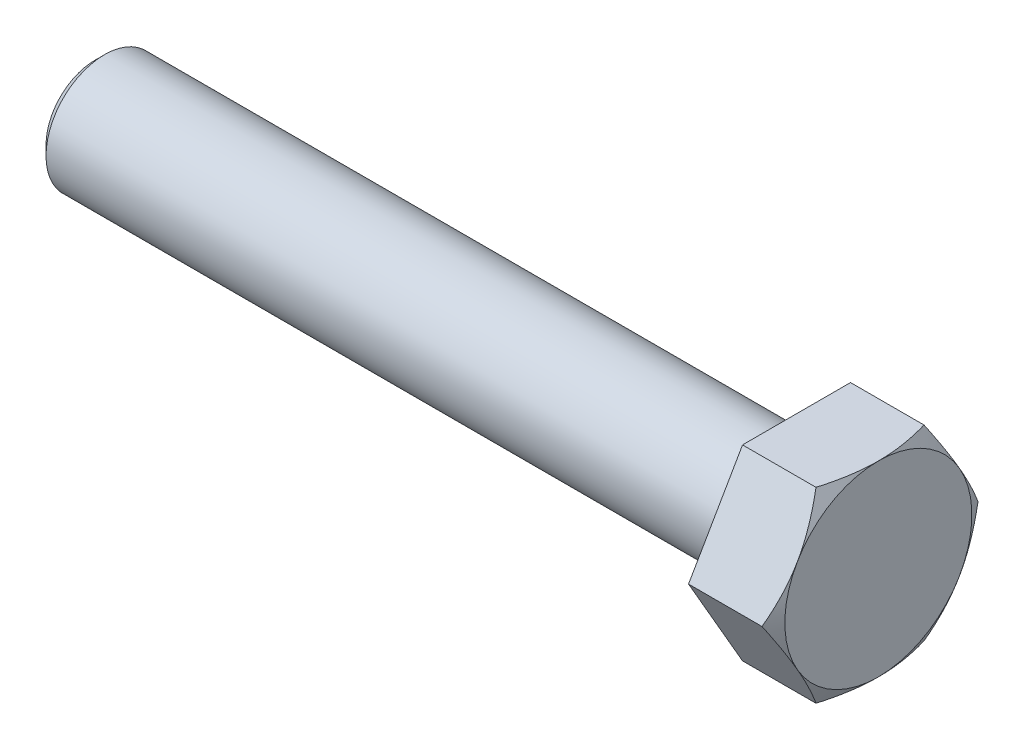
ISO-10303-21;
HEADER;
FILE_DESCRIPTION(('STEP AP214'),'2;1');
FILE_NAME('part.step','',(''),(''),'','','');
FILE_SCHEMA(('AUTOMOTIVE_DESIGN { 1 0 10303 214 1 1 1 1 }'));
ENDSEC;
DATA;
#1=APPLICATION_CONTEXT('core data for automotive mechanical design processes');
#2=APPLICATION_PROTOCOL_DEFINITION('international standard','automotive_design',2000,#1);
#3=PRODUCT_CONTEXT('',#1,'mechanical');
#4=PRODUCT('Part','Part','',(#3));
#5=PRODUCT_RELATED_PRODUCT_CATEGORY('part','',(#4));
#6=PRODUCT_DEFINITION_FORMATION('','',#4);
#7=PRODUCT_DEFINITION_CONTEXT('part definition',#1,'design');
#8=PRODUCT_DEFINITION('design','',#6,#7);
#9=PRODUCT_DEFINITION_SHAPE('','',#8);
#10=(LENGTH_UNIT() NAMED_UNIT(*) SI_UNIT(.MILLI.,.METRE.));
#11=(NAMED_UNIT(*) PLANE_ANGLE_UNIT() SI_UNIT($,.RADIAN.));
#12=(NAMED_UNIT(*) SI_UNIT($,.STERADIAN.) SOLID_ANGLE_UNIT());
#13=UNCERTAINTY_MEASURE_WITH_UNIT(LENGTH_MEASURE(1.E-05),#10,'distance_accuracy_value','');
#14=(GEOMETRIC_REPRESENTATION_CONTEXT(3) GLOBAL_UNCERTAINTY_ASSIGNED_CONTEXT((#13)) GLOBAL_UNIT_ASSIGNED_CONTEXT((#10,
#11,#12)) REPRESENTATION_CONTEXT('',''));
#15=CARTESIAN_POINT('',(0.,0.,0.));
#16=DIRECTION('',(0.,0.,1.));
#17=DIRECTION('',(1.,0.,0.));
#18=AXIS2_PLACEMENT_3D('',#15,#16,#17);
#19=CARTESIAN_POINT('',(0.,0.,0.));
#20=DIRECTION('',(1.,0.,0.));
#21=DIRECTION('',(0.,0.,-1.));
#22=AXIS2_PLACEMENT_3D('',#19,#20,#21);
#23=CYLINDRICAL_SURFACE('',#22,2.1);
#24=CARTESIAN_POINT('',(0.,0.,0.));
#25=DIRECTION('',(1.,0.,0.));
#26=DIRECTION('',(0.,0.,1.));
#27=AXIS2_PLACEMENT_3D('',#24,#25,#26);
#28=CIRCLE('',#27,2.1);
#29=CARTESIAN_POINT('',(0.,0.,2.1));
#30=VERTEX_POINT('',#29);
#31=EDGE_CURVE('P0_E11',#30,#30,#28,.T.);
#32=ORIENTED_EDGE('',*,*,#31,.T.);
#33=CARTESIAN_POINT('',(30.,0.,2.1));
#34=DIRECTION('',(-1.,0.,0.));
#35=VECTOR('',#34,1.);
#36=LINE('',#33,#35);
#37=CARTESIAN_POINT('',(30.,0.,2.1));
#38=VERTEX_POINT('',#37);
#39=EDGE_CURVE('P0_E24',#38,#30,#36,.T.);
#40=ORIENTED_EDGE('',*,*,#39,.F.);
#41=CARTESIAN_POINT('',(30.,0.,0.));
#42=DIRECTION('',(-1.,0.,0.));
#43=DIRECTION('',(0.,0.,1.));
#44=AXIS2_PLACEMENT_3D('',#41,#42,#43);
#45=CIRCLE('',#44,2.1);
#46=EDGE_CURVE('P0_E33',#38,#38,#45,.T.);
#47=ORIENTED_EDGE('',*,*,#46,.T.);
#48=ORIENTED_EDGE('',*,*,#39,.T.);
#49=EDGE_LOOP('',(#32,#40,#47,#48));
#50=FACE_BOUND('',#49,.T.);
#51=ADVANCED_FACE('P0_F16',(#50),#23,.T.);
#52=OPEN_SHELL('',(#51));
#53=SHELL_BASED_SURFACE_MODEL('P0_B1',(#52));
#54=CARTESIAN_POINT('',(33.5,0.,0.));
#55=DIRECTION('',(1.,0.,0.));
#56=DIRECTION('',(0.,1.,0.));
#57=AXIS2_PLACEMENT_3D('',#54,#55,#56);
#58=PLANE('',#57);
#59=CARTESIAN_POINT('',(33.5000000000036,0.,0.));
#60=DIRECTION('',(-1.,0.,0.));
#61=DIRECTION('',(0.,0.,1.));
#62=AXIS2_PLACEMENT_3D('',#59,#60,#61);
#63=CIRCLE('',#62,4.00000000004094);
#64=CARTESIAN_POINT('',(33.5000000000036,-4.00000000002047,-2.62654266027289E-10));
#65=VERTEX_POINT('',#64);
#66=CARTESIAN_POINT('',(33.5000000000036,-2.00000000023777,3.46410161502409));
#67=VERTEX_POINT('',#66);
#68=EDGE_CURVE('P1_E147',#65,#67,#63,.T.);
#69=ORIENTED_EDGE('',*,*,#68,.F.);
#70=CARTESIAN_POINT('',(33.5000000000036,0.,0.));
#71=DIRECTION('',(-1.,0.,0.));
#72=DIRECTION('',(0.,0.,1.));
#73=AXIS2_PLACEMENT_3D('',#70,#71,#72);
#74=CIRCLE('',#73,4.00000000004094);
#75=CARTESIAN_POINT('',(33.5000000000036,-1.99999999978298,-3.46410161528696));
#76=VERTEX_POINT('',#75);
#77=EDGE_CURVE('P1_E11',#76,#65,#74,.T.);
#78=ORIENTED_EDGE('',*,*,#77,.F.);
#79=CARTESIAN_POINT('',(33.5000000000036,0.,0.));
#80=DIRECTION('',(-1.,0.,0.));
#81=DIRECTION('',(0.,0.,1.));
#82=AXIS2_PLACEMENT_3D('',#79,#80,#81);
#83=CIRCLE('',#82,4.00000000004094);
#84=CARTESIAN_POINT('',(33.5000000000036,2.00000000023777,-3.46410161502409));
#85=VERTEX_POINT('',#84);
#86=EDGE_CURVE('P1_E30',#85,#76,#83,.T.);
#87=ORIENTED_EDGE('',*,*,#86,.F.);
#88=CARTESIAN_POINT('',(33.5000000000036,0.,0.));
#89=DIRECTION('',(-1.,0.,0.));
#90=DIRECTION('',(0.,0.,1.));
#91=AXIS2_PLACEMENT_3D('',#88,#89,#90);
#92=CIRCLE('',#91,4.00000000004094);
#93=CARTESIAN_POINT('',(33.5000000000036,4.00000000002047,2.62657129722398E-10));
#94=VERTEX_POINT('',#93);
#95=EDGE_CURVE('P1_E159',#94,#85,#92,.T.);
#96=ORIENTED_EDGE('',*,*,#95,.F.);
#97=CARTESIAN_POINT('',(33.5000000000036,0.,0.));
#98=DIRECTION('',(-1.,0.,0.));
#99=DIRECTION('',(0.,0.,1.));
#100=AXIS2_PLACEMENT_3D('',#97,#98,#99);
#101=CIRCLE('',#100,4.00000000004094);
#102=CARTESIAN_POINT('',(33.5000000000036,1.99999999978299,3.46410161528696));
#103=VERTEX_POINT('',#102);
#104=EDGE_CURVE('P1_E191',#103,#94,#101,.T.);
#105=ORIENTED_EDGE('',*,*,#104,.F.);
#106=CARTESIAN_POINT('',(33.5000000000036,0.,0.));
#107=DIRECTION('',(-1.,0.,0.));
#108=DIRECTION('',(0.,0.,1.));
#109=AXIS2_PLACEMENT_3D('',#106,#107,#108);
#110=CIRCLE('',#109,4.00000000004094);
#111=EDGE_CURVE('P1_E215',#67,#103,#110,.T.);
#112=ORIENTED_EDGE('',*,*,#111,.F.);
#113=EDGE_LOOP('',(#69,#78,#87,#96,#105,#112));
#114=FACE_BOUND('',#113,.T.);
#115=ADVANCED_FACE('P1_F17',(#114),#58,.T.);
#116=CARTESIAN_POINT('',(33.1405908165721,0.,0.));
#117=DIRECTION('',(-1.,0.,0.));
#118=DIRECTION('',(0.,0.,1.));
#119=AXIS2_PLACEMENT_3D('',#116,#117,#118);
#120=CONICAL_SURFACE('',#119,4.62251496641922,1.0471975511743);
#121=CARTESIAN_POINT('',(33.1427344100955,-4.,-2.30940107677662));
#122=CARTESIAN_POINT('',(33.4999999999844,-4.,-1.07179676988044));
#123=CARTESIAN_POINT('',(33.5000000000273,-4.,-2.77408171987373E-10));
#124=(BOUNDED_CURVE() B_SPLINE_CURVE(2,(#121,#122,#123),.UNSPECIFIED.,.F.,
.F.) B_SPLINE_CURVE_WITH_KNOTS((3,3),(0.740616445844047,1.19730459386999),
.UNSPECIFIED.) CURVE() GEOMETRIC_REPRESENTATION_ITEM() RATIONAL_B_SPLINE_CURVE((1.83253175468753,
1.97427857919487,1.97427857921322)) REPRESENTATION_ITEM(''));
#125=CARTESIAN_POINT('',(33.1427344101002,-4.,-2.30940107676041));
#126=VERTEX_POINT('',#125);
#127=EDGE_CURVE('P1_E164',#126,#65,#124,.T.);
#128=ORIENTED_EDGE('',*,*,#127,.F.);
#129=CARTESIAN_POINT('',(33.500000000027,-1.99999999976014,-3.46410161527679));
#130=CARTESIAN_POINT('',(33.5000000000699,-2.92820323015247,-2.92820323034707));
#131=CARTESIAN_POINT('',(33.142734410096,-4.00000000001361,-2.30940107675114));
#132=(BOUNDED_CURVE() B_SPLINE_CURVE(2,(#129,#130,#131),.UNSPECIFIED.,.F.,
.F.) B_SPLINE_CURVE_WITH_KNOTS((3,3),(1.19730459386998,1.65399274201361),
.UNSPECIFIED.) CURVE() GEOMETRIC_REPRESENTATION_ITEM() RATIONAL_B_SPLINE_CURVE((1.97427857921305,
1.97427857923139,1.83253175468769)) REPRESENTATION_ITEM(''));
#133=EDGE_CURVE('P1_E161',#76,#126,#132,.T.);
#134=ORIENTED_EDGE('',*,*,#133,.F.);
#135=ORIENTED_EDGE('',*,*,#77,.T.);
#136=EDGE_LOOP('',(#128,#134,#135));
#137=FACE_BOUND('',#136,.T.);
#138=ADVANCED_FACE('P1_F162',(#137),#120,.T.);
#139=CARTESIAN_POINT('',(33.1405908165721,0.,0.));
#140=DIRECTION('',(-1.,0.,0.));
#141=DIRECTION('',(0.,6.75016823618894E-11,-1.));
#142=AXIS2_PLACEMENT_3D('',#139,#140,#141);
#143=CONICAL_SURFACE('',#142,4.62251496641922,1.0471975511743);
#144=CARTESIAN_POINT('',(33.5000000000273,2.00000000024026,-3.46410161499898));
#145=CARTESIAN_POINT('',(33.5000000000702,1.0717967698477,-3.99999999992883));
#146=CARTESIAN_POINT('',(33.1427344100961,-1.38049372752228E-11,-4.61880215352497));
#147=(BOUNDED_CURVE() B_SPLINE_CURVE(2,(#144,#145,#146),.UNSPECIFIED.,.F.,
.F.) B_SPLINE_CURVE_WITH_KNOTS((3,3),(1.19730459387,1.65399274201378),
.UNSPECIFIED.) CURVE() GEOMETRIC_REPRESENTATION_ITEM() RATIONAL_B_SPLINE_CURVE((1.97427857921324,
1.97427857923158,1.83253175468777)) REPRESENTATION_ITEM(''));
#148=CARTESIAN_POINT('',(33.1427344101002,1.07499901628068E-12,-4.61880215351792));
#149=VERTEX_POINT('',#148);
#150=EDGE_CURVE('P1_E156',#85,#149,#147,.T.);
#151=ORIENTED_EDGE('',*,*,#150,.F.);
#152=ORIENTED_EDGE('',*,*,#86,.T.);
#153=CARTESIAN_POINT('',(33.1427344100954,1.49524002882188E-11,-4.61880215352624));
#154=CARTESIAN_POINT('',(33.4999999999841,-1.07179676958995,-4.00000000007825));
#155=CARTESIAN_POINT('',(33.500000000027,-1.99999999976014,-3.46410161527679));
#156=(BOUNDED_CURVE() B_SPLINE_CURVE(2,(#153,#154,#155),.UNSPECIFIED.,.F.,
.F.) B_SPLINE_CURVE_WITH_KNOTS((3,3),(0.740616445844138,1.19730459386998),
.UNSPECIFIED.) CURVE() GEOMETRIC_REPRESENTATION_ITEM() RATIONAL_B_SPLINE_CURVE((1.83253175468745,
1.97427857919471,1.97427857921305)) REPRESENTATION_ITEM(''));
#157=EDGE_CURVE('P1_E153',#149,#76,#156,.T.);
#158=ORIENTED_EDGE('',*,*,#157,.F.);
#159=EDGE_LOOP('',(#151,#152,#158));
#160=FACE_BOUND('',#159,.T.);
#161=ADVANCED_FACE('P1_F151',(#160),#143,.T.);
#162=CARTESIAN_POINT('',(33.1405908165721,0.,0.));
#163=DIRECTION('',(-1.,0.,0.));
#164=DIRECTION('',(0.,0.,1.));
#165=AXIS2_PLACEMENT_3D('',#162,#163,#164);
#166=CONICAL_SURFACE('',#165,4.62251496641922,1.0471975511743);
#167=CARTESIAN_POINT('',(33.5000000000273,4.,2.77405022862927E-10));
#168=CARTESIAN_POINT('',(33.5000000000702,4.,-1.07179676958222));
#169=CARTESIAN_POINT('',(33.1427344100961,4.,-2.30940107677439));
#170=(BOUNDED_CURVE() B_SPLINE_CURVE(2,(#167,#168,#169),.UNSPECIFIED.,.F.,
.F.) B_SPLINE_CURVE_WITH_KNOTS((3,3),(1.19730459386999,1.65399274201375),
.UNSPECIFIED.) CURVE() GEOMETRIC_REPRESENTATION_ITEM() RATIONAL_B_SPLINE_CURVE((1.97427857921322,
1.97427857923156,1.83253175468776)) REPRESENTATION_ITEM(''));
#171=CARTESIAN_POINT('',(33.1427344101003,4.00000000000112,-2.30940107675805));
#172=VERTEX_POINT('',#171);
#173=EDGE_CURVE('P1_E226',#94,#172,#170,.T.);
#174=ORIENTED_EDGE('',*,*,#173,.F.);
#175=ORIENTED_EDGE('',*,*,#95,.T.);
#176=CARTESIAN_POINT('',(33.1427344100957,4.00000000001505,-2.3094010767497));
#177=CARTESIAN_POINT('',(33.4999999999844,2.92820323041032,-2.9282032301976));
#178=CARTESIAN_POINT('',(33.5000000000273,2.00000000024026,-3.46410161499898));
#179=(BOUNDED_CURVE() B_SPLINE_CURVE(2,(#176,#177,#178),.UNSPECIFIED.,.F.,
.F.) B_SPLINE_CURVE_WITH_KNOTS((3,3),(0.740616445844176,1.19730459387),
.UNSPECIFIED.) CURVE() GEOMETRIC_REPRESENTATION_ITEM() RATIONAL_B_SPLINE_CURVE((1.83253175468762,
1.9742785791949,1.97427857921324)) REPRESENTATION_ITEM(''));
#180=EDGE_CURVE('P1_E203',#172,#85,#179,.T.);
#181=ORIENTED_EDGE('',*,*,#180,.F.);
#182=EDGE_LOOP('',(#174,#175,#181));
#183=FACE_BOUND('',#182,.T.);
#184=ADVANCED_FACE('P1_F531',(#183),#166,.T.);
#185=CARTESIAN_POINT('',(33.1405908165721,0.,0.));
#186=DIRECTION('',(-1.,0.,0.));
#187=DIRECTION('',(0.,0.,1.));
#188=AXIS2_PLACEMENT_3D('',#185,#186,#187);
#189=CONICAL_SURFACE('',#188,4.62251496641922,1.0471975511743);
#190=CARTESIAN_POINT('',(33.1427344100955,4.,2.30940107677662));
#191=CARTESIAN_POINT('',(33.4999999999844,4.,1.07179676988044));
#192=CARTESIAN_POINT('',(33.5000000000273,4.,2.77405022862927E-10));
#193=(BOUNDED_CURVE() B_SPLINE_CURVE(2,(#190,#191,#192),.UNSPECIFIED.,.F.,
.F.) B_SPLINE_CURVE_WITH_KNOTS((3,3),(0.740616445844047,1.19730459386999),
.UNSPECIFIED.) CURVE() GEOMETRIC_REPRESENTATION_ITEM() RATIONAL_B_SPLINE_CURVE((1.83253175468753,
1.97427857919487,1.97427857921322)) REPRESENTATION_ITEM(''));
#194=CARTESIAN_POINT('',(33.1427344101002,4.,2.30940107676041));
#195=VERTEX_POINT('',#194);
#196=EDGE_CURVE('P1_E232',#195,#94,#193,.T.);
#197=ORIENTED_EDGE('',*,*,#196,.F.);
#198=CARTESIAN_POINT('',(33.500000000027,1.99999999976013,3.46410161527679));
#199=CARTESIAN_POINT('',(33.5000000000699,2.92820323015247,2.92820323034707));
#200=CARTESIAN_POINT('',(33.142734410096,4.00000000001361,2.30940107675114));
#201=(BOUNDED_CURVE() B_SPLINE_CURVE(2,(#198,#199,#200),.UNSPECIFIED.,.F.,
.F.) B_SPLINE_CURVE_WITH_KNOTS((3,3),(1.19730459386998,1.65399274201361),
.UNSPECIFIED.) CURVE() GEOMETRIC_REPRESENTATION_ITEM() RATIONAL_B_SPLINE_CURVE((1.97427857921305,
1.97427857923139,1.83253175468769)) REPRESENTATION_ITEM(''));
#202=EDGE_CURVE('P1_E188',#103,#195,#201,.T.);
#203=ORIENTED_EDGE('',*,*,#202,.F.);
#204=ORIENTED_EDGE('',*,*,#104,.T.);
#205=EDGE_LOOP('',(#197,#203,#204));
#206=FACE_BOUND('',#205,.T.);
#207=ADVANCED_FACE('P1_F522',(#206),#189,.T.);
#208=CARTESIAN_POINT('',(33.1405908165721,0.,0.));
#209=DIRECTION('',(-1.,0.,0.));
#210=DIRECTION('',(0.,0.,1.));
#211=AXIS2_PLACEMENT_3D('',#208,#209,#210);
#212=CONICAL_SURFACE('',#211,4.62251496641922,1.0471975511743);
#213=CARTESIAN_POINT('',(33.5000000000273,-4.,-2.77408171987373E-10));
#214=CARTESIAN_POINT('',(33.5000000000702,-4.,1.07179676958274));
#215=CARTESIAN_POINT('',(33.1427344100957,-4.,2.30940107677569));
#216=(BOUNDED_CURVE() B_SPLINE_CURVE(2,(#213,#214,#215),.UNSPECIFIED.,.F.,
.F.) B_SPLINE_CURVE_WITH_KNOTS((3,3),(1.19730459386999,1.65399274201398),
.UNSPECIFIED.) CURVE() GEOMETRIC_REPRESENTATION_ITEM() RATIONAL_B_SPLINE_CURVE((1.97427857921322,
1.97427857923156,1.83253175468763)) REPRESENTATION_ITEM(''));
#217=CARTESIAN_POINT('',(33.1427344100999,-4.00000000000112,2.30940107675933));
#218=VERTEX_POINT('',#217);
#219=EDGE_CURVE('P1_E192',#65,#218,#216,.T.);
#220=ORIENTED_EDGE('',*,*,#219,.F.);
#221=ORIENTED_EDGE('',*,*,#68,.T.);
#222=CARTESIAN_POINT('',(33.1427344100959,-4.00000000001463,2.30940107674994));
#223=CARTESIAN_POINT('',(33.4999999999844,-2.92820323041015,2.92820323019769));
#224=CARTESIAN_POINT('',(33.5000000000273,-2.00000000024027,3.46410161499897));
#225=(BOUNDED_CURVE() B_SPLINE_CURVE(2,(#222,#223,#224),.UNSPECIFIED.,.F.,
.F.) B_SPLINE_CURVE_WITH_KNOTS((3,3),(0.740616445844259,1.19730459387),
.UNSPECIFIED.) CURVE() GEOMETRIC_REPRESENTATION_ITEM() RATIONAL_B_SPLINE_CURVE((1.83253175468768,
1.9742785791949,1.97427857921324)) REPRESENTATION_ITEM(''));
#226=EDGE_CURVE('P1_E189',#218,#67,#225,.T.);
#227=ORIENTED_EDGE('',*,*,#226,.F.);
#228=EDGE_LOOP('',(#220,#221,#227));
#229=FACE_BOUND('',#228,.T.);
#230=ADVANCED_FACE('P1_F321',(#229),#212,.T.);
#231=CARTESIAN_POINT('',(0.,0.,0.));
#232=DIRECTION('',(-1.,0.,0.));
#233=DIRECTION('',(0.,0.,1.));
#234=AXIS2_PLACEMENT_3D('',#231,#232,#233);
#235=PLANE('',#234);
#236=CARTESIAN_POINT('',(0.,0.,0.));
#237=DIRECTION('',(1.,0.,0.));
#238=DIRECTION('',(0.,0.,-1.));
#239=AXIS2_PLACEMENT_3D('',#236,#237,#238);
#240=CIRCLE('',#239,2.09999999998445);
#241=CARTESIAN_POINT('',(0.,0.,2.09999999998445));
#242=VERTEX_POINT('',#241);
#243=EDGE_CURVE('P1_E220',#242,#242,#240,.T.);
#244=ORIENTED_EDGE('',*,*,#243,.F.);
#245=EDGE_LOOP('',(#244));
#246=FACE_BOUND('',#245,.T.);
#247=ADVANCED_FACE('P1_F502',(#246),#235,.T.);
#248=CARTESIAN_POINT('',(30.,-4.,0.));
#249=DIRECTION('',(0.,-1.,0.));
#250=DIRECTION('',(0.,0.,-1.));
#251=AXIS2_PLACEMENT_3D('',#248,#249,#250);
#252=PLANE('',#251);
#253=DIRECTION('',(-1.,0.,0.));
#254=VECTOR('',#253,1.);
#255=CARTESIAN_POINT('',(30.,-4.,-2.309401076759));
#256=LINE('',#255,#254);
#257=CARTESIAN_POINT('',(30.,-4.,-2.309401076759));
#258=VERTEX_POINT('',#257);
#259=EDGE_CURVE('P1_E80',#126,#258,#256,.T.);
#260=ORIENTED_EDGE('',*,*,#259,.F.);
#261=ORIENTED_EDGE('',*,*,#127,.T.);
#262=ORIENTED_EDGE('',*,*,#219,.T.);
#263=DIRECTION('',(1.,0.,0.));
#264=VECTOR('',#263,1.);
#265=CARTESIAN_POINT('',(30.,-3.99999999999974,2.30940107675854));
#266=LINE('',#265,#264);
#267=CARTESIAN_POINT('',(30.,-3.99999999999974,2.30940107675854));
#268=VERTEX_POINT('',#267);
#269=EDGE_CURVE('P1_E66',#268,#218,#266,.T.);
#270=ORIENTED_EDGE('',*,*,#269,.F.);
#271=DIRECTION('',(0.,0.,-1.));
#272=VECTOR('',#271,1.);
#273=CARTESIAN_POINT('',(30.,-4.,0.));
#274=LINE('',#273,#272);
#275=EDGE_CURVE('P1_E202',#268,#258,#274,.T.);
#276=ORIENTED_EDGE('',*,*,#275,.T.);
#277=EDGE_LOOP('',(#260,#261,#262,#270,#276));
#278=FACE_BOUND('',#277,.T.);
#279=ADVANCED_FACE('P1_F319',(#278),#252,.T.);
#280=CARTESIAN_POINT('',(30.,-4.,-2.309401076759));
#281=DIRECTION('',(0.,-0.500000000000017,-0.866025403784429));
#282=DIRECTION('',(0.,-0.866025403784429,0.500000000000017));
#283=AXIS2_PLACEMENT_3D('',#280,#281,#282);
#284=PLANE('',#283);
#285=DIRECTION('',(-1.,0.,0.));
#286=VECTOR('',#285,1.);
#287=CARTESIAN_POINT('',(30.,0.,-4.618802153517));
#288=LINE('',#287,#286);
#289=CARTESIAN_POINT('',(30.,0.,-4.61880215351706));
#290=VERTEX_POINT('',#289);
#291=EDGE_CURVE('P1_E168',#149,#290,#288,.T.);
#292=ORIENTED_EDGE('',*,*,#291,.F.);
#293=ORIENTED_EDGE('',*,*,#157,.T.);
#294=ORIENTED_EDGE('',*,*,#133,.T.);
#295=ORIENTED_EDGE('',*,*,#259,.T.);
#296=DIRECTION('',(0.,0.866025403784486,-0.499999999999918));
#297=VECTOR('',#296,1.);
#298=CARTESIAN_POINT('',(30.,-4.,-2.309401076759));
#299=LINE('',#298,#297);
#300=EDGE_CURVE('P1_E274',#258,#290,#299,.T.);
#301=ORIENTED_EDGE('',*,*,#300,.T.);
#302=EDGE_LOOP('',(#292,#293,#294,#295,#301));
#303=FACE_BOUND('',#302,.T.);
#304=ADVANCED_FACE('P1_F167',(#303),#284,.T.);
#305=CARTESIAN_POINT('',(30.,0.,-4.618802153517));
#306=DIRECTION('',(0.,0.500000000000017,-0.866025403784429));
#307=DIRECTION('',(-1.,0.,0.));
#308=AXIS2_PLACEMENT_3D('',#305,#306,#307);
#309=PLANE('',#308);
#310=DIRECTION('',(-1.,0.,0.));
#311=VECTOR('',#310,1.);
#312=CARTESIAN_POINT('',(30.,4.,-2.309401076759));
#313=LINE('',#312,#311);
#314=CARTESIAN_POINT('',(30.,4.,-2.30940107675889));
#315=VERTEX_POINT('',#314);
#316=EDGE_CURVE('P1_E207',#172,#315,#313,.T.);
#317=ORIENTED_EDGE('',*,*,#316,.F.);
#318=ORIENTED_EDGE('',*,*,#180,.T.);
#319=ORIENTED_EDGE('',*,*,#150,.T.);
#320=ORIENTED_EDGE('',*,*,#291,.T.);
#321=DIRECTION('',(0.,0.866025403784486,0.499999999999918));
#322=VECTOR('',#321,1.);
#323=CARTESIAN_POINT('',(30.,0.,-4.618802153517));
#324=LINE('',#323,#322);
#325=EDGE_CURVE('P1_E283',#290,#315,#324,.T.);
#326=ORIENTED_EDGE('',*,*,#325,.T.);
#327=EDGE_LOOP('',(#317,#318,#319,#320,#326));
#328=FACE_BOUND('',#327,.T.);
#329=ADVANCED_FACE('P1_F471',(#328),#309,.T.);
#330=CARTESIAN_POINT('',(30.,4.,-2.309401076759));
#331=DIRECTION('',(0.,1.,0.));
#332=DIRECTION('',(1.,0.,0.));
#333=AXIS2_PLACEMENT_3D('',#330,#331,#332);
#334=PLANE('',#333);
#335=DIRECTION('',(-1.,0.,0.));
#336=VECTOR('',#335,1.);
#337=CARTESIAN_POINT('',(30.,4.,2.309401076759));
#338=LINE('',#337,#336);
#339=CARTESIAN_POINT('',(30.,4.,2.309401076759));
#340=VERTEX_POINT('',#339);
#341=EDGE_CURVE('P1_E114',#195,#340,#338,.T.);
#342=ORIENTED_EDGE('',*,*,#341,.F.);
#343=ORIENTED_EDGE('',*,*,#196,.T.);
#344=ORIENTED_EDGE('',*,*,#173,.T.);
#345=ORIENTED_EDGE('',*,*,#316,.T.);
#346=DIRECTION('',(0.,0.,1.));
#347=VECTOR('',#346,1.);
#348=CARTESIAN_POINT('',(30.,4.,0.));
#349=LINE('',#348,#347);
#350=EDGE_CURVE('P1_E290',#315,#340,#349,.T.);
#351=ORIENTED_EDGE('',*,*,#350,.T.);
#352=EDGE_LOOP('',(#342,#343,#344,#345,#351));
#353=FACE_BOUND('',#352,.T.);
#354=ADVANCED_FACE('P1_F461',(#353),#334,.T.);
#355=CARTESIAN_POINT('',(30.,4.,2.309401076759));
#356=DIRECTION('',(0.,0.500000000000017,0.866025403784429));
#357=DIRECTION('',(1.,0.,0.));
#358=AXIS2_PLACEMENT_3D('',#355,#356,#357);
#359=PLANE('',#358);
#360=DIRECTION('',(-1.,0.,0.));
#361=VECTOR('',#360,1.);
#362=CARTESIAN_POINT('',(30.,0.,4.618802153517));
#363=LINE('',#362,#361);
#364=CARTESIAN_POINT('',(33.1427344101002,-1.09276690065011E-12,4.61880215351793));
#365=VERTEX_POINT('',#364);
#366=CARTESIAN_POINT('',(30.,0.,4.61880215351706));
#367=VERTEX_POINT('',#366);
#368=EDGE_CURVE('P1_E98',#365,#367,#363,.T.);
#369=ORIENTED_EDGE('',*,*,#368,.F.);
#370=CARTESIAN_POINT('',(33.1427344100954,-1.49751799129752E-11,4.61880215352625));
#371=CARTESIAN_POINT('',(33.4999999999841,1.07179676958993,4.00000000007826));
#372=CARTESIAN_POINT('',(33.500000000027,1.99999999976013,3.46410161527679));
#373=(BOUNDED_CURVE() B_SPLINE_CURVE(2,(#370,#371,#372),.UNSPECIFIED.,.F.,
.F.) B_SPLINE_CURVE_WITH_KNOTS((3,3),(0.740616445844134,1.19730459386998),
.UNSPECIFIED.) CURVE() GEOMETRIC_REPRESENTATION_ITEM() RATIONAL_B_SPLINE_CURVE((1.83253175468744,
1.97427857919471,1.97427857921305)) REPRESENTATION_ITEM(''));
#374=EDGE_CURVE('P1_E219',#365,#103,#373,.T.);
#375=ORIENTED_EDGE('',*,*,#374,.T.);
#376=ORIENTED_EDGE('',*,*,#202,.T.);
#377=ORIENTED_EDGE('',*,*,#341,.T.);
#378=DIRECTION('',(0.,-0.866025403784486,0.499999999999918));
#379=VECTOR('',#378,1.);
#380=CARTESIAN_POINT('',(30.,4.,2.309401076759));
#381=LINE('',#380,#379);
#382=EDGE_CURVE('P1_E293',#340,#367,#381,.T.);
#383=ORIENTED_EDGE('',*,*,#382,.T.);
#384=EDGE_LOOP('',(#369,#375,#376,#377,#383));
#385=FACE_BOUND('',#384,.T.);
#386=ADVANCED_FACE('P1_F452',(#385),#359,.T.);
#387=CARTESIAN_POINT('',(30.,0.,4.618802153517));
#388=DIRECTION('',(0.,-0.500000000000017,0.866025403784429));
#389=DIRECTION('',(-1.,0.,0.));
#390=AXIS2_PLACEMENT_3D('',#387,#388,#389);
#391=PLANE('',#390);
#392=ORIENTED_EDGE('',*,*,#269,.T.);
#393=ORIENTED_EDGE('',*,*,#226,.T.);
#394=CARTESIAN_POINT('',(33.5000000000273,-2.00000000024028,3.46410161499897));
#395=CARTESIAN_POINT('',(33.5000000000702,-1.07179676984773,3.99999999992882));
#396=CARTESIAN_POINT('',(33.1427344100961,1.37775532582285E-11,4.61880215352495));
#397=(BOUNDED_CURVE() B_SPLINE_CURVE(2,(#394,#395,#396),.UNSPECIFIED.,.F.,
.F.) B_SPLINE_CURVE_WITH_KNOTS((3,3),(-1.19730459398819,-0.740616445844411),
.UNSPECIFIED.) CURVE() GEOMETRIC_REPRESENTATION_ITEM() RATIONAL_B_SPLINE_CURVE((1.97427857921324,
1.97427857923158,1.83253175468777)) REPRESENTATION_ITEM(''));
#398=EDGE_CURVE('P1_E21',#67,#365,#397,.T.);
#399=ORIENTED_EDGE('',*,*,#398,.T.);
#400=ORIENTED_EDGE('',*,*,#368,.T.);
#401=DIRECTION('',(0.,-0.866025403784486,-0.499999999999918));
#402=VECTOR('',#401,1.);
#403=CARTESIAN_POINT('',(30.,0.,4.618802153517));
#404=LINE('',#403,#402);
#405=EDGE_CURVE('P1_E196',#367,#268,#404,.T.);
#406=ORIENTED_EDGE('',*,*,#405,.T.);
#407=EDGE_LOOP('',(#392,#393,#399,#400,#406));
#408=FACE_BOUND('',#407,.T.);
#409=ADVANCED_FACE('P1_F19',(#408),#391,.T.);
#410=CARTESIAN_POINT('',(30.,0.,0.));
#411=DIRECTION('',(1.,0.,0.));
#412=DIRECTION('',(0.,1.,0.));
#413=AXIS2_PLACEMENT_3D('',#410,#411,#412);
#414=PLANE('',#413);
#415=CARTESIAN_POINT('',(30.,0.,0.));
#416=DIRECTION('',(-1.,0.,0.));
#417=DIRECTION('',(0.,0.,1.));
#418=AXIS2_PLACEMENT_3D('',#415,#416,#417);
#419=CIRCLE('',#418,2.5);
#420=CARTESIAN_POINT('',(30.,0.,-2.5));
#421=VERTEX_POINT('',#420);
#422=EDGE_CURVE('P1_E221',#421,#421,#419,.T.);
#423=ORIENTED_EDGE('',*,*,#422,.F.);
#424=EDGE_LOOP('',(#423));
#425=FACE_BOUND('',#424,.T.);
#426=ORIENTED_EDGE('',*,*,#382,.F.);
#427=ORIENTED_EDGE('',*,*,#350,.F.);
#428=ORIENTED_EDGE('',*,*,#325,.F.);
#429=ORIENTED_EDGE('',*,*,#300,.F.);
#430=ORIENTED_EDGE('',*,*,#275,.F.);
#431=ORIENTED_EDGE('',*,*,#405,.F.);
#432=EDGE_LOOP('',(#426,#427,#428,#429,#430,#431));
#433=FACE_BOUND('',#432,.T.);
#434=ADVANCED_FACE('P1_F327',(#425,#433),#414,.F.);
#435=CARTESIAN_POINT('',(33.1405908165721,0.,0.));
#436=DIRECTION('',(-1.,0.,0.));
#437=DIRECTION('',(0.,0.,1.));
#438=AXIS2_PLACEMENT_3D('',#435,#436,#437);
#439=CONICAL_SURFACE('',#438,4.62251496641922,1.0471975511743);
#440=ORIENTED_EDGE('',*,*,#111,.T.);
#441=ORIENTED_EDGE('',*,*,#374,.F.);
#442=ORIENTED_EDGE('',*,*,#398,.F.);
#443=EDGE_LOOP('',(#440,#441,#442));
#444=FACE_BOUND('',#443,.T.);
#445=ADVANCED_FACE('P1_F419',(#444),#439,.T.);
#446=CARTESIAN_POINT('',(0.399999999899592,0.,0.));
#447=DIRECTION('',(1.,0.,0.));
#448=DIRECTION('',(0.,0.,-1.));
#449=AXIS2_PLACEMENT_3D('',#446,#447,#448);
#450=CONICAL_SURFACE('',#449,2.49999999988404,0.785398163397448);
#451=CARTESIAN_POINT('',(0.4,0.,0.));
#452=DIRECTION('',(1.,0.,0.));
#453=DIRECTION('',(0.,0.,1.));
#454=AXIS2_PLACEMENT_3D('',#451,#452,#453);
#455=CIRCLE('',#454,2.5);
#456=CARTESIAN_POINT('',(0.4,0.,2.49999999998445));
#457=VERTEX_POINT('',#456);
#458=CARTESIAN_POINT('',(0.4,0.,-2.5));
#459=VERTEX_POINT('',#458);
#460=EDGE_CURVE('P1_E257',#457,#459,#455,.T.);
#461=ORIENTED_EDGE('',*,*,#460,.F.);
#462=DIRECTION('',(-0.707106781186548,0.,-0.707106781186548));
#463=VECTOR('',#462,1.);
#464=CARTESIAN_POINT('',(0.399999999899592,0.,2.49999999988404));
#465=LINE('',#464,#463);
#466=EDGE_CURVE('P1_E241',#457,#242,#465,.T.);
#467=ORIENTED_EDGE('',*,*,#466,.T.);
#468=ORIENTED_EDGE('',*,*,#243,.T.);
#469=ORIENTED_EDGE('',*,*,#466,.F.);
#470=CARTESIAN_POINT('',(0.4,0.,0.));
#471=DIRECTION('',(1.,0.,0.));
#472=DIRECTION('',(0.,0.,1.));
#473=AXIS2_PLACEMENT_3D('',#470,#471,#472);
#474=CIRCLE('',#473,2.5);
#475=EDGE_CURVE('P1_E224',#459,#457,#474,.T.);
#476=ORIENTED_EDGE('',*,*,#475,.F.);
#477=EDGE_LOOP('',(#461,#467,#468,#469,#476));
#478=FACE_BOUND('',#477,.T.);
#479=ADVANCED_FACE('P1_F405',(#478),#450,.T.);
#480=CARTESIAN_POINT('',(31.5,0.,0.));
#481=DIRECTION('',(-1.,0.,0.));
#482=DIRECTION('',(0.,0.,1.));
#483=AXIS2_PLACEMENT_3D('',#480,#481,#482);
#484=CYLINDRICAL_SURFACE('',#483,2.5);
#485=ORIENTED_EDGE('',*,*,#460,.T.);
#486=DIRECTION('',(1.,0.,0.));
#487=VECTOR('',#486,1.);
#488=CARTESIAN_POINT('',(31.5,0.,-2.5));
#489=LINE('',#488,#487);
#490=EDGE_CURVE('P1_E225',#459,#421,#489,.T.);
#491=ORIENTED_EDGE('',*,*,#490,.T.);
#492=ORIENTED_EDGE('',*,*,#422,.T.);
#493=ORIENTED_EDGE('',*,*,#490,.F.);
#494=ORIENTED_EDGE('',*,*,#475,.T.);
#495=EDGE_LOOP('',(#485,#491,#492,#493,#494));
#496=FACE_BOUND('',#495,.T.);
#497=ADVANCED_FACE('P1_F399',(#496),#484,.T.);
#498=CLOSED_SHELL('',(#115,#138,#161,#184,#207,#230,#247,#279,#304,#329,#354,#386,#409,#434,
#445,#479,#497));
#499=MANIFOLD_SOLID_BREP('P1_B1',#498);
#500=ADVANCED_BREP_SHAPE_REPRESENTATION('',(#18,#499),#14);
#501=MANIFOLD_SURFACE_SHAPE_REPRESENTATION('',(#18,#53),#14);
#502=SHAPE_REPRESENTATION('',(#18),#14);
#503=SHAPE_DEFINITION_REPRESENTATION(#9,#502);
#504=SHAPE_REPRESENTATION_RELATIONSHIP('','',#502,#500);
#505=SHAPE_REPRESENTATION_RELATIONSHIP('','',#502,#501);
ENDSEC;
END-ISO-10303-21;
